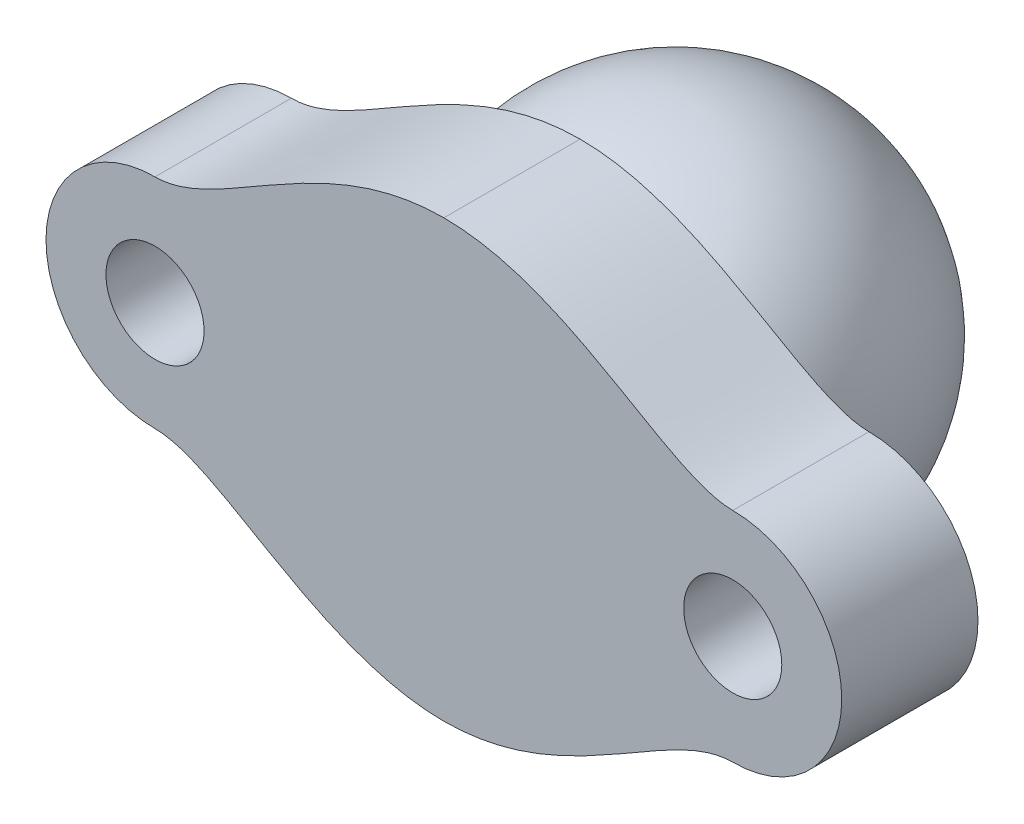
ISO-10303-21;
HEADER;
FILE_DESCRIPTION(('STEP AP214'),'2;1');
FILE_NAME('part.step','',(''),(''),'','','');
FILE_SCHEMA(('AUTOMOTIVE_DESIGN { 1 0 10303 214 1 1 1 1 }'));
ENDSEC;
DATA;
#1=APPLICATION_CONTEXT('core data for automotive mechanical design processes');
#2=APPLICATION_PROTOCOL_DEFINITION('international standard','automotive_design',2000,#1);
#3=PRODUCT_CONTEXT('',#1,'mechanical');
#4=PRODUCT('Part','Part','',(#3));
#5=PRODUCT_RELATED_PRODUCT_CATEGORY('part','',(#4));
#6=PRODUCT_DEFINITION_FORMATION('','',#4);
#7=PRODUCT_DEFINITION_CONTEXT('part definition',#1,'design');
#8=PRODUCT_DEFINITION('design','',#6,#7);
#9=PRODUCT_DEFINITION_SHAPE('','',#8);
#10=(LENGTH_UNIT() NAMED_UNIT(*) SI_UNIT(.MILLI.,.METRE.));
#11=(NAMED_UNIT(*) PLANE_ANGLE_UNIT() SI_UNIT($,.RADIAN.));
#12=(NAMED_UNIT(*) SI_UNIT($,.STERADIAN.) SOLID_ANGLE_UNIT());
#13=UNCERTAINTY_MEASURE_WITH_UNIT(LENGTH_MEASURE(1.E-05),#10,'distance_accuracy_value','');
#14=(GEOMETRIC_REPRESENTATION_CONTEXT(3) GLOBAL_UNCERTAINTY_ASSIGNED_CONTEXT((#13)) GLOBAL_UNIT_ASSIGNED_CONTEXT((#10,
#11,#12)) REPRESENTATION_CONTEXT('',''));
#15=CARTESIAN_POINT('',(0.,0.,0.));
#16=DIRECTION('',(0.,0.,1.));
#17=DIRECTION('',(1.,0.,0.));
#18=AXIS2_PLACEMENT_3D('',#15,#16,#17);
#19=CARTESIAN_POINT('',(-6.731,2.54,3.175));
#20=CARTESIAN_POINT('',(-5.18754285561849,2.54,3.175));
#21=CARTESIAN_POINT('',(-2.92113624984748,5.08018046558474,3.175));
#22=CARTESIAN_POINT('',(0.,5.08,3.175));
#23=B_SPLINE_CURVE_WITH_KNOTS('',3,(#19,#20,#21,#22),.UNSPECIFIED.,.F.,.F.,(4,4),(0.,1.),.UNSPECIFIED.);
#24=DIRECTION('',(0.,0.,-1.));
#25=VECTOR('',#24,1.);
#26=SURFACE_OF_LINEAR_EXTRUSION('',#23,#25);
#27=CARTESIAN_POINT('',(-6.731,2.54,0.));
#28=CARTESIAN_POINT('',(-5.18754285561849,2.54,0.));
#29=CARTESIAN_POINT('',(-2.92113624984748,5.08018046558474,0.));
#30=CARTESIAN_POINT('',(0.,5.08,0.));
#31=B_SPLINE_CURVE_WITH_KNOTS('',3,(#27,#28,#29,#30),.UNSPECIFIED.,.F.,.F.,(4,4),(0.,1.),.UNSPECIFIED.);
#32=CARTESIAN_POINT('',(-6.731,2.54,0.));
#33=VERTEX_POINT('',#32);
#34=CARTESIAN_POINT('',(0.,5.08,0.));
#35=VERTEX_POINT('',#34);
#36=EDGE_CURVE('E151',#33,#35,#31,.T.);
#37=ORIENTED_EDGE('',*,*,#36,.F.);
#38=DIRECTION('',(0.,0.,-1.));
#39=VECTOR('',#38,1.);
#40=CARTESIAN_POINT('',(-6.731,2.54,3.175));
#41=LINE('',#40,#39);
#42=CARTESIAN_POINT('',(-6.731,2.54,3.175));
#43=VERTEX_POINT('',#42);
#44=EDGE_CURVE('E11',#43,#33,#41,.T.);
#45=ORIENTED_EDGE('',*,*,#44,.F.);
#46=CARTESIAN_POINT('',(0.,5.08,3.175));
#47=VERTEX_POINT('',#46);
#48=EDGE_CURVE('E186',#43,#47,#23,.T.);
#49=ORIENTED_EDGE('',*,*,#48,.T.);
#50=DIRECTION('',(0.,0.,-1.));
#51=VECTOR('',#50,1.);
#52=CARTESIAN_POINT('',(0.,5.08,3.175));
#53=LINE('',#52,#51);
#54=EDGE_CURVE('E82',#47,#35,#53,.T.);
#55=ORIENTED_EDGE('',*,*,#54,.T.);
#56=EDGE_LOOP('',(#37,#45,#49,#55));
#57=FACE_BOUND('',#56,.T.);
#58=ADVANCED_FACE('F37',(#57),#26,.T.);
#59=CARTESIAN_POINT('',(-6.731,0.,3.175));
#60=DIRECTION('',(0.,0.,-1.));
#61=DIRECTION('',(-1.,0.,0.));
#62=AXIS2_PLACEMENT_3D('',#59,#60,#61);
#63=CYLINDRICAL_SURFACE('',#62,2.54);
#64=CARTESIAN_POINT('',(-6.731,0.,0.));
#65=DIRECTION('',(0.,0.,1.));
#66=DIRECTION('',(1.,0.,0.));
#67=AXIS2_PLACEMENT_3D('',#64,#65,#66);
#68=CIRCLE('',#67,2.54);
#69=CARTESIAN_POINT('',(-6.731,-2.54,0.));
#70=VERTEX_POINT('',#69);
#71=EDGE_CURVE('E145',#70,#33,#68,.F.);
#72=ORIENTED_EDGE('',*,*,#71,.F.);
#73=DIRECTION('',(0.,0.,-1.));
#74=VECTOR('',#73,1.);
#75=CARTESIAN_POINT('',(-6.731,-2.54,3.175));
#76=LINE('',#75,#74);
#77=CARTESIAN_POINT('',(-6.731,-2.54,3.175));
#78=VERTEX_POINT('',#77);
#79=EDGE_CURVE('E46',#78,#70,#76,.T.);
#80=ORIENTED_EDGE('',*,*,#79,.F.);
#81=CARTESIAN_POINT('',(-6.731,0.,3.175));
#82=DIRECTION('',(0.,0.,1.));
#83=DIRECTION('',(1.,0.,0.));
#84=AXIS2_PLACEMENT_3D('',#81,#82,#83);
#85=CIRCLE('',#84,2.54);
#86=EDGE_CURVE('E116',#78,#43,#85,.F.);
#87=ORIENTED_EDGE('',*,*,#86,.T.);
#88=ORIENTED_EDGE('',*,*,#44,.T.);
#89=EDGE_LOOP('',(#72,#80,#87,#88));
#90=FACE_BOUND('',#89,.T.);
#91=ADVANCED_FACE('F136',(#90),#63,.T.);
#92=CARTESIAN_POINT('',(-6.731,-2.54,3.175));
#93=CARTESIAN_POINT('',(-5.18754285561849,-2.54,3.175));
#94=CARTESIAN_POINT('',(-2.92113624984748,-5.08018046558475,3.175));
#95=CARTESIAN_POINT('',(0.,-5.08,3.175));
#96=B_SPLINE_CURVE_WITH_KNOTS('',3,(#92,#93,#94,#95),.UNSPECIFIED.,.F.,.F.,(4,4),(0.,1.),.UNSPECIFIED.);
#97=DIRECTION('',(0.,0.,-1.));
#98=VECTOR('',#97,1.);
#99=SURFACE_OF_LINEAR_EXTRUSION('',#96,#98);
#100=CARTESIAN_POINT('',(-6.731,-2.54,0.));
#101=CARTESIAN_POINT('',(-5.18754285561849,-2.54,0.));
#102=CARTESIAN_POINT('',(-2.92113624984748,-5.08018046558475,0.));
#103=CARTESIAN_POINT('',(0.,-5.08,0.));
#104=B_SPLINE_CURVE_WITH_KNOTS('',3,(#100,#101,#102,#103),.UNSPECIFIED.,.F.,.F.,(4,4),(0.,1.),.UNSPECIFIED.);
#105=CARTESIAN_POINT('',(0.,-5.08,0.));
#106=VERTEX_POINT('',#105);
#107=EDGE_CURVE('E150',#70,#106,#104,.T.);
#108=ORIENTED_EDGE('',*,*,#107,.T.);
#109=DIRECTION('',(0.,0.,-1.));
#110=VECTOR('',#109,1.);
#111=CARTESIAN_POINT('',(0.,-5.08,3.175));
#112=LINE('',#111,#110);
#113=CARTESIAN_POINT('',(0.,-5.08,3.175));
#114=VERTEX_POINT('',#113);
#115=EDGE_CURVE('E103',#114,#106,#112,.T.);
#116=ORIENTED_EDGE('',*,*,#115,.F.);
#117=EDGE_CURVE('E113',#78,#114,#96,.T.);
#118=ORIENTED_EDGE('',*,*,#117,.F.);
#119=ORIENTED_EDGE('',*,*,#79,.T.);
#120=EDGE_LOOP('',(#108,#116,#118,#119));
#121=FACE_BOUND('',#120,.T.);
#122=ADVANCED_FACE('F133',(#121),#99,.F.);
#123=CARTESIAN_POINT('',(6.731,-2.54,3.175));
#124=CARTESIAN_POINT('',(5.18754285561849,-2.54,3.175));
#125=CARTESIAN_POINT('',(2.92113624984748,-5.08018046558475,3.175));
#126=CARTESIAN_POINT('',(0.,-5.08,3.175));
#127=B_SPLINE_CURVE_WITH_KNOTS('',3,(#123,#124,#125,#126),.UNSPECIFIED.,.F.,.F.,(4,4),(0.,1.),.UNSPECIFIED.);
#128=DIRECTION('',(0.,0.,-1.));
#129=VECTOR('',#128,1.);
#130=SURFACE_OF_LINEAR_EXTRUSION('',#127,#129);
#131=CARTESIAN_POINT('',(6.731,-2.54,0.));
#132=CARTESIAN_POINT('',(5.18754285561849,-2.54,0.));
#133=CARTESIAN_POINT('',(2.92113624984748,-5.08018046558475,0.));
#134=CARTESIAN_POINT('',(0.,-5.08,0.));
#135=B_SPLINE_CURVE_WITH_KNOTS('',3,(#131,#132,#133,#134),.UNSPECIFIED.,.F.,.F.,(4,4),(0.,1.),.UNSPECIFIED.);
#136=CARTESIAN_POINT('',(6.731,-2.54,0.));
#137=VERTEX_POINT('',#136);
#138=EDGE_CURVE('E102',#137,#106,#135,.T.);
#139=ORIENTED_EDGE('',*,*,#138,.F.);
#140=DIRECTION('',(0.,0.,-1.));
#141=VECTOR('',#140,1.);
#142=CARTESIAN_POINT('',(6.731,-2.54,3.175));
#143=LINE('',#142,#141);
#144=CARTESIAN_POINT('',(6.731,-2.54,3.175));
#145=VERTEX_POINT('',#144);
#146=EDGE_CURVE('E96',#145,#137,#143,.T.);
#147=ORIENTED_EDGE('',*,*,#146,.F.);
#148=EDGE_CURVE('E100',#145,#114,#127,.T.);
#149=ORIENTED_EDGE('',*,*,#148,.T.);
#150=ORIENTED_EDGE('',*,*,#115,.T.);
#151=EDGE_LOOP('',(#139,#147,#149,#150));
#152=FACE_BOUND('',#151,.T.);
#153=ADVANCED_FACE('F98',(#152),#130,.T.);
#154=CARTESIAN_POINT('',(6.731,0.,3.175));
#155=DIRECTION('',(0.,0.,-1.));
#156=DIRECTION('',(-1.,0.,0.));
#157=AXIS2_PLACEMENT_3D('',#154,#155,#156);
#158=CYLINDRICAL_SURFACE('',#157,2.54);
#159=CARTESIAN_POINT('',(6.731,0.,0.));
#160=DIRECTION('',(0.,0.,1.));
#161=DIRECTION('',(1.,0.,0.));
#162=AXIS2_PLACEMENT_3D('',#159,#160,#161);
#163=CIRCLE('',#162,2.54);
#164=CARTESIAN_POINT('',(6.731,2.54,0.));
#165=VERTEX_POINT('',#164);
#166=EDGE_CURVE('E75',#137,#165,#163,.T.);
#167=ORIENTED_EDGE('',*,*,#166,.T.);
#168=DIRECTION('',(0.,0.,-1.));
#169=VECTOR('',#168,1.);
#170=CARTESIAN_POINT('',(6.731,2.54,3.175));
#171=LINE('',#170,#169);
#172=CARTESIAN_POINT('',(6.731,2.54,3.175));
#173=VERTEX_POINT('',#172);
#174=EDGE_CURVE('E104',#173,#165,#171,.T.);
#175=ORIENTED_EDGE('',*,*,#174,.F.);
#176=CARTESIAN_POINT('',(6.731,0.,3.175));
#177=DIRECTION('',(0.,0.,1.));
#178=DIRECTION('',(1.,0.,0.));
#179=AXIS2_PLACEMENT_3D('',#176,#177,#178);
#180=CIRCLE('',#179,2.54);
#181=EDGE_CURVE('E106',#145,#173,#180,.T.);
#182=ORIENTED_EDGE('',*,*,#181,.F.);
#183=ORIENTED_EDGE('',*,*,#146,.T.);
#184=EDGE_LOOP('',(#167,#175,#182,#183));
#185=FACE_BOUND('',#184,.T.);
#186=ADVANCED_FACE('F107',(#185),#158,.T.);
#187=CARTESIAN_POINT('',(6.731,0.,3.175));
#188=DIRECTION('',(0.,0.,-1.));
#189=DIRECTION('',(-1.,0.,0.));
#190=AXIS2_PLACEMENT_3D('',#187,#188,#189);
#191=CYLINDRICAL_SURFACE('',#190,1.143);
#192=CARTESIAN_POINT('',(6.731,0.,3.175));
#193=DIRECTION('',(0.,0.,1.));
#194=DIRECTION('',(1.,0.,0.));
#195=AXIS2_PLACEMENT_3D('',#192,#193,#194);
#196=CIRCLE('',#195,1.143);
#197=CARTESIAN_POINT('',(7.874,0.,3.175));
#198=VERTEX_POINT('',#197);
#199=EDGE_CURVE('E195',#198,#198,#196,.T.);
#200=ORIENTED_EDGE('',*,*,#199,.T.);
#201=EDGE_LOOP('',(#200));
#202=FACE_BOUND('',#201,.T.);
#203=CARTESIAN_POINT('',(6.731,0.,0.));
#204=DIRECTION('',(0.,0.,1.));
#205=DIRECTION('',(1.,0.,0.));
#206=AXIS2_PLACEMENT_3D('',#203,#204,#205);
#207=CIRCLE('',#206,1.143);
#208=CARTESIAN_POINT('',(7.874,0.,0.));
#209=VERTEX_POINT('',#208);
#210=EDGE_CURVE('E177',#209,#209,#207,.T.);
#211=ORIENTED_EDGE('',*,*,#210,.F.);
#212=EDGE_LOOP('',(#211));
#213=FACE_BOUND('',#212,.T.);
#214=ADVANCED_FACE('F207',(#202,#213),#191,.F.);
#215=CARTESIAN_POINT('',(6.731,2.54,3.175));
#216=CARTESIAN_POINT('',(5.18754285561849,2.54,3.175));
#217=CARTESIAN_POINT('',(2.92113624984748,5.08018046558475,3.175));
#218=CARTESIAN_POINT('',(0.,5.08,3.175));
#219=B_SPLINE_CURVE_WITH_KNOTS('',3,(#215,#216,#217,#218),.UNSPECIFIED.,.F.,.F.,(4,4),(0.,1.),.UNSPECIFIED.);
#220=DIRECTION('',(0.,0.,-1.));
#221=VECTOR('',#220,1.);
#222=SURFACE_OF_LINEAR_EXTRUSION('',#219,#221);
#223=CARTESIAN_POINT('',(6.731,2.54,0.));
#224=CARTESIAN_POINT('',(5.18754285561849,2.54,0.));
#225=CARTESIAN_POINT('',(2.92113624984748,5.08018046558475,0.));
#226=CARTESIAN_POINT('',(0.,5.08,0.));
#227=B_SPLINE_CURVE_WITH_KNOTS('',3,(#223,#224,#225,#226),.UNSPECIFIED.,.F.,.F.,(4,4),(0.,1.),.UNSPECIFIED.);
#228=EDGE_CURVE('E173',#165,#35,#227,.T.);
#229=ORIENTED_EDGE('',*,*,#228,.T.);
#230=ORIENTED_EDGE('',*,*,#54,.F.);
#231=EDGE_CURVE('E54',#173,#47,#219,.T.);
#232=ORIENTED_EDGE('',*,*,#231,.F.);
#233=ORIENTED_EDGE('',*,*,#174,.T.);
#234=EDGE_LOOP('',(#229,#230,#232,#233));
#235=FACE_BOUND('',#234,.T.);
#236=ADVANCED_FACE('F194',(#235),#222,.F.);
#237=CARTESIAN_POINT('',(-6.731,0.,3.175));
#238=DIRECTION('',(0.,0.,-1.));
#239=DIRECTION('',(-1.,0.,0.));
#240=AXIS2_PLACEMENT_3D('',#237,#238,#239);
#241=CYLINDRICAL_SURFACE('',#240,1.143);
#242=CARTESIAN_POINT('',(-6.731,0.,3.175));
#243=DIRECTION('',(0.,0.,1.));
#244=DIRECTION('',(1.,0.,0.));
#245=AXIS2_PLACEMENT_3D('',#242,#243,#244);
#246=CIRCLE('',#245,1.143);
#247=CARTESIAN_POINT('',(-5.588,0.,3.175));
#248=VERTEX_POINT('',#247);
#249=EDGE_CURVE('E188',#248,#248,#246,.F.);
#250=ORIENTED_EDGE('',*,*,#249,.F.);
#251=EDGE_LOOP('',(#250));
#252=FACE_BOUND('',#251,.T.);
#253=CARTESIAN_POINT('',(-6.731,0.,0.));
#254=DIRECTION('',(0.,0.,1.));
#255=DIRECTION('',(1.,0.,0.));
#256=AXIS2_PLACEMENT_3D('',#253,#254,#255);
#257=CIRCLE('',#256,1.143);
#258=CARTESIAN_POINT('',(-5.588,0.,0.));
#259=VERTEX_POINT('',#258);
#260=EDGE_CURVE('E183',#259,#259,#257,.F.);
#261=ORIENTED_EDGE('',*,*,#260,.T.);
#262=EDGE_LOOP('',(#261));
#263=FACE_BOUND('',#262,.T.);
#264=ADVANCED_FACE('F206',(#252,#263),#241,.F.);
#265=CARTESIAN_POINT('',(0.,-15.095195435713,3.175));
#266=DIRECTION('',(0.,0.,1.));
#267=DIRECTION('',(1.,0.,0.));
#268=AXIS2_PLACEMENT_3D('',#265,#266,#267);
#269=PLANE('',#268);
#270=ORIENTED_EDGE('',*,*,#48,.F.);
#271=ORIENTED_EDGE('',*,*,#86,.F.);
#272=ORIENTED_EDGE('',*,*,#117,.T.);
#273=ORIENTED_EDGE('',*,*,#148,.F.);
#274=ORIENTED_EDGE('',*,*,#181,.T.);
#275=ORIENTED_EDGE('',*,*,#231,.T.);
#276=EDGE_LOOP('',(#270,#271,#272,#273,#274,#275));
#277=FACE_BOUND('',#276,.T.);
#278=ORIENTED_EDGE('',*,*,#199,.F.);
#279=EDGE_LOOP('',(#278));
#280=FACE_BOUND('',#279,.T.);
#281=ORIENTED_EDGE('',*,*,#249,.T.);
#282=EDGE_LOOP('',(#281));
#283=FACE_BOUND('',#282,.T.);
#284=ADVANCED_FACE('F109',(#277,#280,#283),#269,.T.);
#285=CARTESIAN_POINT('',(0.,-15.095195435713,0.));
#286=DIRECTION('',(0.,0.,1.));
#287=DIRECTION('',(1.,0.,0.));
#288=AXIS2_PLACEMENT_3D('',#285,#286,#287);
#289=PLANE('',#288);
#290=CARTESIAN_POINT('',(0.,0.,0.));
#291=DIRECTION('',(0.,0.,1.));
#292=DIRECTION('',(1.,0.,0.));
#293=AXIS2_PLACEMENT_3D('',#290,#291,#292);
#294=CIRCLE('',#293,4.21211348375135);
#295=CARTESIAN_POINT('',(4.21211348375135,0.,0.));
#296=VERTEX_POINT('',#295);
#297=EDGE_CURVE('E155',#296,#296,#294,.T.);
#298=ORIENTED_EDGE('',*,*,#297,.T.);
#299=EDGE_LOOP('',(#298));
#300=FACE_BOUND('',#299,.T.);
#301=ORIENTED_EDGE('',*,*,#36,.T.);
#302=ORIENTED_EDGE('',*,*,#228,.F.);
#303=ORIENTED_EDGE('',*,*,#166,.F.);
#304=ORIENTED_EDGE('',*,*,#138,.T.);
#305=ORIENTED_EDGE('',*,*,#107,.F.);
#306=ORIENTED_EDGE('',*,*,#71,.T.);
#307=EDGE_LOOP('',(#301,#302,#303,#304,#305,#306));
#308=FACE_BOUND('',#307,.T.);
#309=ORIENTED_EDGE('',*,*,#210,.T.);
#310=EDGE_LOOP('',(#309));
#311=FACE_BOUND('',#310,.T.);
#312=ORIENTED_EDGE('',*,*,#260,.F.);
#313=EDGE_LOOP('',(#312));
#314=FACE_BOUND('',#313,.T.);
#315=ADVANCED_FACE('F190',(#300,#308,#311,#314),#289,.F.);
#316=CARTESIAN_POINT('',(0.,0.,-2.2225));
#317=DIRECTION('',(0.,0.,1.));
#318=DIRECTION('',(1.,0.,0.));
#319=AXIS2_PLACEMENT_3D('',#316,#317,#318);
#320=SPHERICAL_SURFACE('',#319,4.7625);
#321=ORIENTED_EDGE('',*,*,#297,.F.);
#322=EDGE_LOOP('',(#321));
#323=FACE_BOUND('',#322,.T.);
#324=ADVANCED_FACE('F216',(#323),#320,.T.);
#325=CLOSED_SHELL('',(#58,#91,#122,#153,#186,#214,#236,#264,#284,#315,#324));
#326=MANIFOLD_SOLID_BREP('B2',#325);
#327=ADVANCED_BREP_SHAPE_REPRESENTATION('',(#18,#326),#14);
#328=SHAPE_DEFINITION_REPRESENTATION(#9,#327);
ENDSEC;
END-ISO-10303-21;
